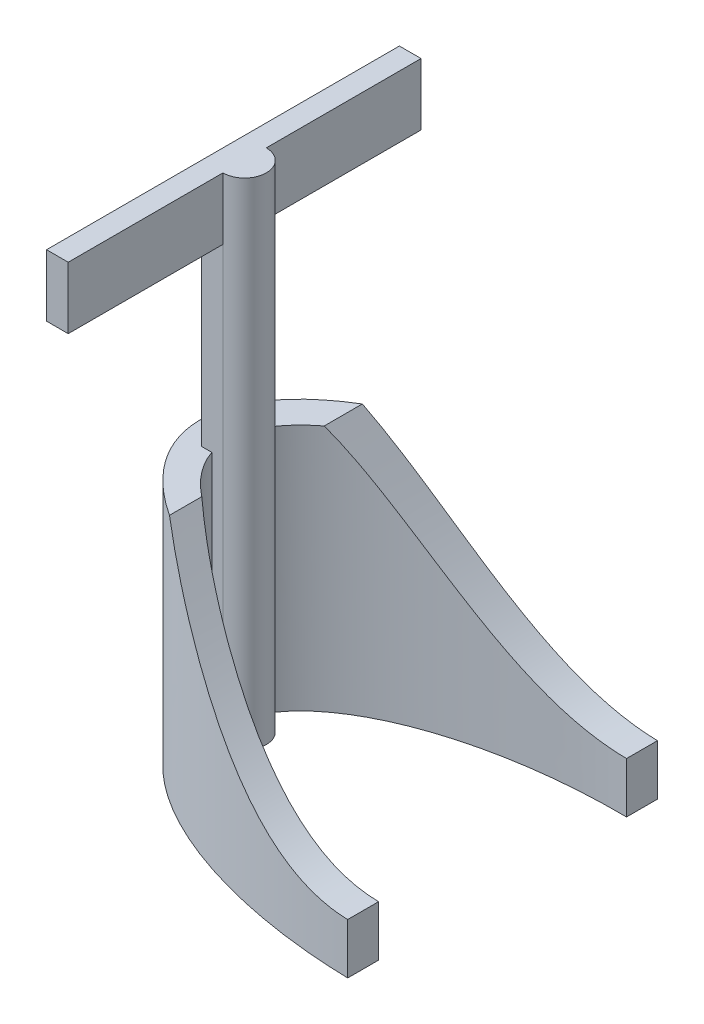
ISO-10303-21;
HEADER;
FILE_DESCRIPTION(('STEP AP214'),'2;1');
FILE_NAME('part.step','',(''),(''),'','','');
FILE_SCHEMA(('AUTOMOTIVE_DESIGN { 1 0 10303 214 1 1 1 1 }'));
ENDSEC;
DATA;
#1=APPLICATION_CONTEXT('core data for automotive mechanical design processes');
#2=APPLICATION_PROTOCOL_DEFINITION('international standard','automotive_design',2000,#1);
#3=PRODUCT_CONTEXT('',#1,'mechanical');
#4=PRODUCT('Part','Part','',(#3));
#5=PRODUCT_RELATED_PRODUCT_CATEGORY('part','',(#4));
#6=PRODUCT_DEFINITION_FORMATION('','',#4);
#7=PRODUCT_DEFINITION_CONTEXT('part definition',#1,'design');
#8=PRODUCT_DEFINITION('design','',#6,#7);
#9=PRODUCT_DEFINITION_SHAPE('','',#8);
#10=(LENGTH_UNIT() NAMED_UNIT(*) SI_UNIT(.MILLI.,.METRE.));
#11=(NAMED_UNIT(*) PLANE_ANGLE_UNIT() SI_UNIT($,.RADIAN.));
#12=(NAMED_UNIT(*) SI_UNIT($,.STERADIAN.) SOLID_ANGLE_UNIT());
#13=UNCERTAINTY_MEASURE_WITH_UNIT(LENGTH_MEASURE(1.E-05),#10,'distance_accuracy_value','');
#14=(GEOMETRIC_REPRESENTATION_CONTEXT(3) GLOBAL_UNCERTAINTY_ASSIGNED_CONTEXT((#13)) GLOBAL_UNIT_ASSIGNED_CONTEXT((#10,
#11,#12)) REPRESENTATION_CONTEXT('',''));
#15=CARTESIAN_POINT('',(0.,0.,0.));
#16=DIRECTION('',(0.,0.,1.));
#17=DIRECTION('',(1.,0.,0.));
#18=AXIS2_PLACEMENT_3D('',#15,#16,#17);
#19=CARTESIAN_POINT('',(-46.2169440098117,0.,-4.54650732705689));
#20=DIRECTION('',(0.,0.,-1.));
#21=DIRECTION('',(-1.,0.,0.));
#22=AXIS2_PLACEMENT_3D('',#19,#20,#21);
#23=PLANE('',#22);
#24=DIRECTION('',(0.,1.,0.));
#25=VECTOR('',#24,1.);
#26=CARTESIAN_POINT('',(-46.2169440098117,0.,-4.54650732705689));
#27=LINE('',#26,#25);
#28=CARTESIAN_POINT('',(-46.2169440098117,40.,-4.54650732705689));
#29=VERTEX_POINT('',#28);
#30=CARTESIAN_POINT('',(-46.2169440098117,70.,-4.54650732705689));
#31=VERTEX_POINT('',#30);
#32=EDGE_CURVE('E322',#29,#31,#27,.T.);
#33=ORIENTED_EDGE('',*,*,#32,.T.);
#34=DIRECTION('',(-1.,0.,0.));
#35=VECTOR('',#34,1.);
#36=CARTESIAN_POINT('',(-42.7169440098117,70.,-4.54650732705689));
#37=LINE('',#36,#35);
#38=CARTESIAN_POINT('',(-42.7169440098117,70.,-4.54650732705689));
#39=VERTEX_POINT('',#38);
#40=EDGE_CURVE('E181',#39,#31,#37,.T.);
#41=ORIENTED_EDGE('',*,*,#40,.F.);
#42=DIRECTION('',(0.,1.,0.));
#43=VECTOR('',#42,1.);
#44=CARTESIAN_POINT('',(-42.7169440098117,0.,-4.54650732705689));
#45=LINE('',#44,#43);
#46=CARTESIAN_POINT('',(-42.7169440098117,0.,-4.54650732705689));
#47=VERTEX_POINT('',#46);
#48=EDGE_CURVE('E302',#39,#47,#45,.F.);
#49=ORIENTED_EDGE('',*,*,#48,.T.);
#50=DIRECTION('',(-1.,0.,0.));
#51=VECTOR('',#50,1.);
#52=CARTESIAN_POINT('',(-46.2169440098117,0.,-4.54650732705689));
#53=LINE('',#52,#51);
#54=CARTESIAN_POINT('',(-44.0652315849738,0.,-4.54650732705689));
#55=VERTEX_POINT('',#54);
#56=EDGE_CURVE('E315',#47,#55,#53,.T.);
#57=ORIENTED_EDGE('',*,*,#56,.T.);
#58=DIRECTION('',(0.,1.,0.));
#59=VECTOR('',#58,1.);
#60=CARTESIAN_POINT('',(-44.0652315849738,0.,-4.54650732705689));
#61=LINE('',#60,#59);
#62=CARTESIAN_POINT('',(-44.0652315849738,40.,-4.54650732705689));
#63=VERTEX_POINT('',#62);
#64=EDGE_CURVE('E295',#63,#55,#61,.F.);
#65=ORIENTED_EDGE('',*,*,#64,.F.);
#66=DIRECTION('',(-1.,0.,0.));
#67=VECTOR('',#66,1.);
#68=CARTESIAN_POINT('',(0.,40.,-4.54650732705689));
#69=LINE('',#68,#67);
#70=EDGE_CURVE('E331',#63,#29,#69,.T.);
#71=ORIENTED_EDGE('',*,*,#70,.T.);
#72=EDGE_LOOP('',(#33,#41,#49,#57,#65,#71));
#73=FACE_BOUND('',#72,.T.);
#74=ADVANCED_FACE('F41',(#73),#23,.T.);
#75=CARTESIAN_POINT('',(-46.2169440098117,0.,2.45349267294311));
#76=DIRECTION('',(0.,0.,1.));
#77=DIRECTION('',(1.,0.,0.));
#78=AXIS2_PLACEMENT_3D('',#75,#76,#77);
#79=PLANE('',#78);
#80=DIRECTION('',(0.,1.,0.));
#81=VECTOR('',#80,1.);
#82=CARTESIAN_POINT('',(-42.7169440098117,0.,2.45349267294311));
#83=LINE('',#82,#81);
#84=CARTESIAN_POINT('',(-42.7169440098117,0.,2.45349267294311));
#85=VERTEX_POINT('',#84);
#86=CARTESIAN_POINT('',(-42.7169440098117,70.,2.45349267294311));
#87=VERTEX_POINT('',#86);
#88=EDGE_CURVE('E308',#85,#87,#83,.T.);
#89=ORIENTED_EDGE('',*,*,#88,.T.);
#90=DIRECTION('',(1.,0.,0.));
#91=VECTOR('',#90,1.);
#92=CARTESIAN_POINT('',(-46.2169440098117,70.,2.45349267294311));
#93=LINE('',#92,#91);
#94=CARTESIAN_POINT('',(-46.2169440098117,70.,2.45349267294311));
#95=VERTEX_POINT('',#94);
#96=EDGE_CURVE('E187',#95,#87,#93,.T.);
#97=ORIENTED_EDGE('',*,*,#96,.F.);
#98=DIRECTION('',(0.,1.,0.));
#99=VECTOR('',#98,1.);
#100=CARTESIAN_POINT('',(-46.2169440098117,0.,2.45349267294311));
#101=LINE('',#100,#99);
#102=CARTESIAN_POINT('',(-46.2169440098117,40.,2.45349267294311));
#103=VERTEX_POINT('',#102);
#104=EDGE_CURVE('E318',#103,#95,#101,.T.);
#105=ORIENTED_EDGE('',*,*,#104,.F.);
#106=DIRECTION('',(1.,0.,0.));
#107=VECTOR('',#106,1.);
#108=CARTESIAN_POINT('',(0.,40.,2.45349267294311));
#109=LINE('',#108,#107);
#110=CARTESIAN_POINT('',(-44.5125584969487,40.,2.4534926729431));
#111=VERTEX_POINT('',#110);
#112=EDGE_CURVE('E328',#103,#111,#109,.T.);
#113=ORIENTED_EDGE('',*,*,#112,.T.);
#114=DIRECTION('',(0.,1.,0.));
#115=VECTOR('',#114,1.);
#116=CARTESIAN_POINT('',(-44.5125584969487,0.,2.45349267294311));
#117=LINE('',#116,#115);
#118=CARTESIAN_POINT('',(-44.5125584969487,0.,2.45349267294309));
#119=VERTEX_POINT('',#118);
#120=EDGE_CURVE('E293',#119,#111,#117,.T.);
#121=ORIENTED_EDGE('',*,*,#120,.F.);
#122=DIRECTION('',(1.,0.,0.));
#123=VECTOR('',#122,1.);
#124=CARTESIAN_POINT('',(-46.2169440098117,0.,2.45349267294311));
#125=LINE('',#124,#123);
#126=EDGE_CURVE('E319',#119,#85,#125,.T.);
#127=ORIENTED_EDGE('',*,*,#126,.T.);
#128=EDGE_LOOP('',(#89,#97,#105,#113,#121,#127));
#129=FACE_BOUND('',#128,.T.);
#130=ADVANCED_FACE('F361',(#129),#79,.T.);
#131=CARTESIAN_POINT('',(-42.7169440098117,80.,-1.04650732705689));
#132=DIRECTION('',(0.,1.,0.));
#133=DIRECTION('',(0.,0.,1.));
#134=AXIS2_PLACEMENT_3D('',#131,#132,#133);
#135=CYLINDRICAL_SURFACE('',#134,3.5);
#136=CARTESIAN_POINT('',(-42.7169440098117,80.,-4.54650732705689));
#137=VERTEX_POINT('',#136);
#138=EDGE_CURVE('E185',#137,#39,#45,.F.);
#139=ORIENTED_EDGE('',*,*,#138,.F.);
#140=CARTESIAN_POINT('',(-42.7169440098117,80.,-1.04650732705689));
#141=DIRECTION('',(0.,1.,0.));
#142=DIRECTION('',(0.,0.,1.));
#143=AXIS2_PLACEMENT_3D('',#140,#141,#142);
#144=CIRCLE('',#143,3.5);
#145=CARTESIAN_POINT('',(-42.7169440098117,80.,2.45349267294311));
#146=VERTEX_POINT('',#145);
#147=EDGE_CURVE('E50',#146,#137,#144,.T.);
#148=ORIENTED_EDGE('',*,*,#147,.F.);
#149=DIRECTION('',(0.,1.,0.));
#150=VECTOR('',#149,1.);
#151=CARTESIAN_POINT('',(-42.7169440098117,80.,2.45349267294311));
#152=LINE('',#151,#150);
#153=EDGE_CURVE('E189',#87,#146,#152,.T.);
#154=ORIENTED_EDGE('',*,*,#153,.F.);
#155=ORIENTED_EDGE('',*,*,#88,.F.);
#156=CARTESIAN_POINT('',(-42.7169440098117,0.,-1.04650732705689));
#157=DIRECTION('',(0.,1.,0.));
#158=DIRECTION('',(0.,0.,1.));
#159=AXIS2_PLACEMENT_3D('',#156,#157,#158);
#160=CIRCLE('',#159,3.5);
#161=EDGE_CURVE('E11',#47,#85,#160,.F.);
#162=ORIENTED_EDGE('',*,*,#161,.F.);
#163=ORIENTED_EDGE('',*,*,#48,.F.);
#164=EDGE_LOOP('',(#139,#148,#154,#155,#162,#163));
#165=FACE_BOUND('',#164,.T.);
#166=ADVANCED_FACE('F44',(#165),#135,.T.);
#167=CARTESIAN_POINT('',(0.,0.,0.));
#168=DIRECTION('',(0.,1.,0.));
#169=DIRECTION('',(0.999906273096402,0.,0.0136910562946586));
#170=AXIS2_PLACEMENT_3D('',#167,#168,#169);
#171=ELLIPSE('',#170,45.0042181060119,20.0259893045715);
#172=DIRECTION('',(0.,1.,0.));
#173=VECTOR('',#172,1.);
#174=SURFACE_OF_LINEAR_EXTRUSION('',#171,#173);
#175=CARTESIAN_POINT('',(-39.1310904542781,40.,-10.3196836821225));
#176=CARTESIAN_POINT('',(-38.9998049745195,39.814564734595,-10.4211225183269));
#177=CARTESIAN_POINT('',(-38.8680689107961,39.6284922208081,-10.5207972536929));
#178=CARTESIAN_POINT('',(-38.6037477692581,39.2552237566391,-10.716843044213));
#179=CARTESIAN_POINT('',(-38.4711627206403,39.0680278449046,-10.813214212261));
#180=CARTESIAN_POINT('',(-38.0723423076516,38.5051650180911,-11.0976170059595));
#181=CARTESIAN_POINT('',(-37.8048999089887,38.1280226042761,-11.2810468852849));
#182=CARTESIAN_POINT('',(-37.2670766666245,37.3708522537992,-11.6370973633573));
#183=CARTESIAN_POINT('',(-36.9966962089053,36.9908246980979,-11.8097193622946));
#184=CARTESIAN_POINT('',(-36.4538177281195,36.2297229046969,-12.1449349002623));
#185=CARTESIAN_POINT('',(-36.1813279470645,35.8486547462869,-12.3075556449352));
#186=CARTESIAN_POINT('',(-35.6334180935527,35.0850338309468,-12.6243428865481));
#187=CARTESIAN_POINT('',(-35.3579976296973,34.7024808801659,-12.7785082368945));
#188=CARTESIAN_POINT('',(-34.8041445590967,33.9365213241368,-13.0792244002623));
#189=CARTESIAN_POINT('',(-34.5257117154659,33.553114653665,-13.2257746091129));
#190=CARTESIAN_POINT('',(-33.7429582578763,32.4809273332778,-13.6258286700174));
#191=CARTESIAN_POINT('',(-33.2351340952529,31.7918382864425,-13.8716787219167));
#192=CARTESIAN_POINT('',(-32.208038287672,30.4157357482259,-14.3445565858386));
#193=CARTESIAN_POINT('',(-31.6887663074604,29.7287223183015,-14.5715838456984));
#194=CARTESIAN_POINT('',(-30.637007922253,28.3595394559415,-15.0093485044357));
#195=CARTESIAN_POINT('',(-30.1045204698313,27.6773704130065,-15.2200846066341));
#196=CARTESIAN_POINT('',(-29.0217892433662,26.3176731391641,-15.628102327966));
#197=CARTESIAN_POINT('',(-28.4714743327757,25.6401813097985,-15.825316726721));
#198=CARTESIAN_POINT('',(-27.3530819333269,24.2963015295646,-16.2066212472192));
#199=CARTESIAN_POINT('',(-26.7850056291754,23.6299128426287,-16.3907122416344));
#200=CARTESIAN_POINT('',(-25.6283401438172,22.311801538597,-16.7467771738113));
#201=CARTESIAN_POINT('',(-25.0397508122072,21.6600790290926,-16.9187510227009));
#202=CARTESIAN_POINT('',(-23.8306687003862,20.36652528896,-17.253507547877));
#203=CARTESIAN_POINT('',(-23.2098444422577,19.724960626518,-17.416127665355));
#204=CARTESIAN_POINT('',(-21.9406644082228,18.4664737298719,-17.7297533305684));
#205=CARTESIAN_POINT('',(-21.2923064504892,17.8495534560854,-17.8807579551927));
#206=CARTESIAN_POINT('',(-19.9642809397788,16.6464283711782,-18.1710224974976));
#207=CARTESIAN_POINT('',(-19.2845946186483,16.0602424338284,-18.3102752296766));
#208=CARTESIAN_POINT('',(-17.8954426632097,14.9303653305458,-18.5754242332665));
#209=CARTESIAN_POINT('',(-17.1861949025521,14.3864267122021,-18.7014001155562));
#210=CARTESIAN_POINT('',(-15.7316616817968,13.3463137855611,-18.9398117797111));
#211=CARTESIAN_POINT('',(-14.9863940654503,12.8501161840801,-19.052254171453));
#212=CARTESIAN_POINT('',(-13.4587925382474,11.9162278622056,-19.2619439286983));
#213=CARTESIAN_POINT('',(-12.6765036794119,11.4784683869674,-19.3592091739116));
#214=CARTESIAN_POINT('',(-11.4469657646645,10.8595959749856,-19.4954254909251));
#215=CARTESIAN_POINT('',(-11.0127706091471,10.6536808607463,-19.5404862697482));
#216=CARTESIAN_POINT('',(-10.134211569928,10.2635254737578,-19.6253546130421));
#217=CARTESIAN_POINT('',(-9.68984805740612,10.0792844113345,-19.6651623689084));
#218=CARTESIAN_POINT('',(-8.7916290984772,9.73416709883579,-19.7391737975997));
#219=CARTESIAN_POINT('',(-8.33777297167822,9.57329253018636,-19.7733770671548));
#220=CARTESIAN_POINT('',(-7.42213808608347,9.27663137391774,-19.8357956162461));
#221=CARTESIAN_POINT('',(-6.96036999623517,9.14081352373134,-19.8640183641392));
#222=CARTESIAN_POINT('',(-6.02963125470742,8.89529284471256,-19.9142157724557));
#223=CARTESIAN_POINT('',(-5.56066100306232,8.78558857098139,-19.936190778588));
#224=CARTESIAN_POINT('',(-4.6171398632267,8.59326010083494,-19.9736204016194));
#225=CARTESIAN_POINT('',(-4.14259187322644,8.5106224335883,-19.9890782631524));
#226=CARTESIAN_POINT('',(-3.4637729992627,8.41252879238316,-20.006318646883));
#227=CARTESIAN_POINT('',(-3.26114599499253,8.38578118646915,-20.0108514115562));
#228=CARTESIAN_POINT('',(-2.85530856842053,8.33725975912449,-20.0186977932172));
#229=CARTESIAN_POINT('',(-2.65209827368623,8.31548492327792,-20.0220116589376));
#230=CARTESIAN_POINT('',(-2.2452135670234,8.27690868115327,-20.0274118394743));
#231=CARTESIAN_POINT('',(-2.04153920155565,8.26010679730315,-20.0294982721847));
#232=CARTESIAN_POINT('',(-1.5319144273683,8.22430480585537,-20.0331715982793));
#233=CARTESIAN_POINT('',(-1.22573565859301,8.20840477115582,-20.0339873415844));
#234=CARTESIAN_POINT('',(-0.612934821383895,8.18765602243178,-20.0328326119535));
#235=CARTESIAN_POINT('',(-0.30631266417538,8.18280996233718,-20.030861470103));
#236=CARTESIAN_POINT('',(0.00026808519977019,8.18343967274385,-20.0274917787802));
#237=B_SPLINE_CURVE_WITH_KNOTS('',3,(#175,#176,#177,#178,#179,#180,#181,#182,#183,#184,#185,
#186,#187,#188,#189,#190,#191,#192,#193,#194,#195,#196,#197,#198,#199,#200,#201,#202,#203,#204,
#205,#206,#207,#208,#209,#210,#211,#212,#213,#214,#215,#216,#217,#218,#219,#220,#221,#222,#223,
#224,#225,#226,#227,#228,#229,#230,#231,#232,#233,#234,#235,#236),.UNSPECIFIED.,.F.,.F.,(4,2,2,
2,2,2,2,2,2,2,2,2,2,2,2,2,2,2,2,2,2,2,2,2,2,2,2,2,2,2,4),(0.,0.746445166798173,1.49286479959908,
2.98489861202233,4.47673872571109,5.96432269842842,7.45210789871622,8.94001095739162,
11.6114876508187,14.2830426837579,16.954810138087,19.6390187102711,22.3230486228099,
25.0070982190432,27.7287581388398,30.4506341324815,33.1741624935523,35.8802994880004,
38.5851093711468,41.2867083475384,42.734152642142,44.1815441841134,45.6290398271761,
47.0747170727485,48.5203143084801,49.9651909850311,50.5784471963468,51.1915781950225,
51.8046502932091,52.7242044398128,53.6439793373754),.UNSPECIFIED.);
#238=CARTESIAN_POINT('',(-39.1310904542781,40.,-10.3196836821224));
#239=VERTEX_POINT('',#238);
#240=CARTESIAN_POINT('',(0.000268085199773768,8.18343967274385,-20.0274917787802));
#241=VERTEX_POINT('',#240);
#242=EDGE_CURVE('E260',#239,#241,#237,.T.);
#243=ORIENTED_EDGE('',*,*,#242,.F.);
#244=CARTESIAN_POINT('',(0.,40.,0.));
#245=DIRECTION('',(0.,1.,0.));
#246=DIRECTION('',(0.999906273096402,0.,0.0136910562946586));
#247=AXIS2_PLACEMENT_3D('',#244,#245,#246);
#248=ELLIPSE('',#247,45.0042181060119,20.0259893045715);
#249=EDGE_CURVE('E340',#239,#63,#248,.T.);
#250=ORIENTED_EDGE('',*,*,#249,.T.);
#251=ORIENTED_EDGE('',*,*,#64,.T.);
#252=CARTESIAN_POINT('',(0.000268085199773838,0.,-20.0274917787802));
#253=VERTEX_POINT('',#252);
#254=EDGE_CURVE('E317',#253,#55,#171,.T.);
#255=ORIENTED_EDGE('',*,*,#254,.F.);
#256=DIRECTION('',(0.,1.,0.));
#257=VECTOR('',#256,1.);
#258=CARTESIAN_POINT('',(0.000268085199773768,0.,-20.0274917787802));
#259=LINE('',#258,#257);
#260=EDGE_CURVE('E283',#241,#253,#259,.F.);
#261=ORIENTED_EDGE('',*,*,#260,.F.);
#262=EDGE_LOOP('',(#243,#250,#251,#255,#261));
#263=FACE_BOUND('',#262,.T.);
#264=ADVANCED_FACE('F342',(#263),#174,.F.);
#265=CARTESIAN_POINT('',(0.000268085199773226,0.,-25.0204545710766));
#266=DIRECTION('',(-1.,0.,0.));
#267=DIRECTION('',(0.,0.,1.));
#268=AXIS2_PLACEMENT_3D('',#265,#266,#267);
#269=PLANE('',#268);
#270=DIRECTION('',(0.,0.,-1.));
#271=VECTOR('',#270,1.);
#272=CARTESIAN_POINT('',(0.000268085199792314,8.18343967274385,144.709903717956));
#273=LINE('',#272,#271);
#274=CARTESIAN_POINT('',(0.000268085199779406,8.18343967274385,25.0204668673225));
#275=VERTEX_POINT('',#274);
#276=CARTESIAN_POINT('',(0.00026808519977881,8.18343967274385,20.0274976663316));
#277=VERTEX_POINT('',#276);
#278=EDGE_CURVE('E390',#275,#277,#273,.T.);
#279=ORIENTED_EDGE('',*,*,#278,.F.);
#280=DIRECTION('',(0.,-1.,0.));
#281=VECTOR('',#280,1.);
#282=CARTESIAN_POINT('',(0.000268085199779406,40.,25.0204668673225));
#283=LINE('',#282,#281);
#284=CARTESIAN_POINT('',(0.000268085199779354,0.,25.0204668673225));
#285=VERTEX_POINT('',#284);
#286=EDGE_CURVE('E285',#285,#275,#283,.F.);
#287=ORIENTED_EDGE('',*,*,#286,.F.);
#288=DIRECTION('',(0.,0.,1.));
#289=VECTOR('',#288,1.);
#290=CARTESIAN_POINT('',(0.000268085199773226,0.,-25.0204545710766));
#291=LINE('',#290,#289);
#292=CARTESIAN_POINT('',(0.000268085199778743,0.,20.0274976663316));
#293=VERTEX_POINT('',#292);
#294=EDGE_CURVE('E338',#293,#285,#291,.T.);
#295=ORIENTED_EDGE('',*,*,#294,.F.);
#296=DIRECTION('',(0.,1.,0.));
#297=VECTOR('',#296,1.);
#298=CARTESIAN_POINT('',(0.00026808519977881,0.,20.0274976663316));
#299=LINE('',#298,#297);
#300=EDGE_CURVE('E290',#293,#277,#299,.T.);
#301=ORIENTED_EDGE('',*,*,#300,.T.);
#302=EDGE_LOOP('',(#279,#287,#295,#301));
#303=FACE_BOUND('',#302,.T.);
#304=ADVANCED_FACE('F273',(#303),#269,.F.);
#305=CARTESIAN_POINT('',(0.,40.,0.));
#306=DIRECTION('',(0.,1.,0.));
#307=DIRECTION('',(0.999532603527299,0.,0.0305708110121383));
#308=AXIS2_PLACEMENT_3D('',#305,#306,#307);
#309=ELLIPSE('',#308,50.023380751716,25.011690375858);
#310=DIRECTION('',(0.,-1.,0.));
#311=VECTOR('',#310,1.);
#312=SURFACE_OF_LINEAR_EXTRUSION('',#309,#311);
#313=CARTESIAN_POINT('',(-39.1310904542781,40.,14.6806397488417));
#314=CARTESIAN_POINT('',(-38.9424088943499,39.7334953671058,14.8036180453569));
#315=CARTESIAN_POINT('',(-38.7533105400779,39.4664004144856,14.9246630214393));
#316=CARTESIAN_POINT('',(-38.3742479913657,38.9312107743613,15.1631157039195));
#317=CARTESIAN_POINT('',(-38.1842838125995,38.6631161049707,15.2805234758637));
#318=CARTESIAN_POINT('',(-37.6131231259071,37.8577151835847,15.6275873754231));
#319=CARTESIAN_POINT('',(-37.2305701252793,37.3191670265593,15.8521414706754));
#320=CARTESIAN_POINT('',(-36.4614582802074,36.2401030309426,16.2891889860367));
#321=CARTESIAN_POINT('',(-36.0748996273405,35.6995872872492,16.5016829798205));
#322=CARTESIAN_POINT('',(-35.2988678864496,34.6200849639547,16.9150412940178));
#323=CARTESIAN_POINT('',(-34.9094145717738,34.081101850064,17.1159518402145));
#324=CARTESIAN_POINT('',(-34.1252636628612,33.0034352270473,17.5082340489551));
#325=CARTESIAN_POINT('',(-33.7305657887879,32.4647517355191,17.6996051998914));
#326=CARTESIAN_POINT('',(-32.9351586313314,31.3888023814698,18.0737289790571));
#327=CARTESIAN_POINT('',(-32.5344491478,30.8515365668516,18.2564813194923));
#328=CARTESIAN_POINT('',(-31.7263461050188,29.7798079027465,18.6140603108301));
#329=CARTESIAN_POINT('',(-31.3189556696324,29.2453438892522,18.7888905297042));
#330=CARTESIAN_POINT('',(-30.4963662349771,28.1801601451261,19.1313616165048));
#331=CARTESIAN_POINT('',(-30.081167500091,27.6494402885539,19.2990027272205));
#332=CARTESIAN_POINT('',(-29.2419006100914,26.5929829560479,19.6276400422237));
#333=CARTESIAN_POINT('',(-28.8178325699373,26.067245415664,19.7886363325575));
#334=CARTESIAN_POINT('',(-27.9574532493613,25.0194036197387,20.105239684867));
#335=CARTESIAN_POINT('',(-27.5210899181306,24.4973323025041,20.2608145021026));
#336=CARTESIAN_POINT('',(-26.6369673352263,23.4611226912835,20.5660374559357));
#337=CARTESIAN_POINT('',(-26.1892077973455,22.9469845970562,20.7156854434434));
#338=CARTESIAN_POINT('',(-25.2809005438618,21.9283487495645,21.009303660937));
#339=CARTESIAN_POINT('',(-24.8203512430862,21.4238522044802,21.1532731817292));
#340=CARTESIAN_POINT('',(-23.7053700236321,20.2349142445701,21.4899141085105));
#341=CARTESIAN_POINT('',(-23.044433869379,19.5558116915252,21.6800439610579));
#342=CARTESIAN_POINT('',(-21.6912759597188,18.2261752586638,22.0496897261115));
#343=CARTESIAN_POINT('',(-20.9990502930721,17.5756449705775,22.2292043051816));
#344=CARTESIAN_POINT('',(-19.578667824542,16.3104886118684,22.5772645948623));
#345=CARTESIAN_POINT('',(-18.8504835292471,15.6958908239795,22.7458016765959));
#346=CARTESIAN_POINT('',(-17.360302614809,14.5170506589573,23.0695368519891));
#347=CARTESIAN_POINT('',(-16.598591901881,13.952473186669,23.2248234053152));
#348=CARTESIAN_POINT('',(-15.0338141463943,12.8802092910798,23.5217328011842));
#349=CARTESIAN_POINT('',(-14.2307743510963,12.3724860690166,23.6633644734615));
#350=CARTESIAN_POINT('',(-12.9949756426517,11.6635487804138,23.8637795151676));
#351=CARTESIAN_POINT('',(-12.5780997479925,11.4361335123557,23.9285433121946));
#352=CARTESIAN_POINT('',(-11.7338808328716,11.0003983104193,24.0537622105901));
#353=CARTESIAN_POINT('',(-11.306539361834,10.7920755713,24.1142179446456));
#354=CARTESIAN_POINT('',(-10.4419201908208,10.39633540086,24.2304275760337));
#355=CARTESIAN_POINT('',(-10.004647895865,10.2089069108609,24.2861839567397));
#356=CARTESIAN_POINT('',(-9.12053093643937,9.85649548572459,24.3926439433611));
#357=CARTESIAN_POINT('',(-8.67368643090641,9.69151217824159,24.4433476330926));
#358=CARTESIAN_POINT('',(-7.7712287752477,9.38551458883546,24.5393162449513));
#359=CARTESIAN_POINT('',(-7.3156148821296,9.24450234791748,24.5845807038617));
#360=CARTESIAN_POINT('',(-6.39733410452821,8.98794825167144,24.6692362464039));
#361=CARTESIAN_POINT('',(-5.93467673774275,8.8723748107001,24.708634593689));
#362=CARTESIAN_POINT('',(-5.00313865684146,8.6675057642073,24.7812802605848));
#363=CARTESIAN_POINT('',(-4.53425841778301,8.57820816469688,24.8145280468708));
#364=CARTESIAN_POINT('',(-3.59198756904144,8.4265797264083,24.8745706891484));
#365=CARTESIAN_POINT('',(-3.11859970673089,8.36423341719375,24.9013692431671));
#366=CARTESIAN_POINT('',(-2.42416510423468,8.29290986835366,24.9356912556502));
#367=CARTESIAN_POINT('',(-2.20429278556848,8.27326128498553,24.9458312077771));
#368=CARTESIAN_POINT('',(-1.76408598312972,8.23975429942922,24.9646729478871));
#369=CARTESIAN_POINT('',(-1.54375160779458,8.22589466460687,24.973375041793));
#370=CARTESIAN_POINT('',(-1.10291580553308,8.20394713987316,24.9893237144114));
#371=CARTESIAN_POINT('',(-0.882414638210588,8.1958548100997,24.9965714096732));
#372=CARTESIAN_POINT('',(-0.441189820752671,8.18537689239559,25.0096126174175));
#373=CARTESIAN_POINT('',(-0.220466135194092,8.18299243539679,25.0154058415142));
#374=CARTESIAN_POINT('',(0.000268085199767805,8.18343967274386,25.0204668673225));
#375=B_SPLINE_CURVE_WITH_KNOTS('',3,(#313,#314,#315,#316,#317,#318,#319,#320,#321,#322,#323,
#324,#325,#326,#327,#328,#329,#330,#331,#332,#333,#334,#335,#336,#337,#338,#339,#340,#341,#342,
#343,#344,#345,#346,#347,#348,#349,#350,#351,#352,#353,#354,#355,#356,#357,#358,#359,#360,#361,
#362,#363,#364,#365,#366,#367,#368,#369,#370,#371,#372,#373,#374),.UNSPECIFIED.,.F.,.F.,(4,2,2,
2,2,2,2,2,2,2,2,2,2,2,2,2,2,2,2,2,2,2,2,2,2,2,2,2,2,2,4),(0.,1.04676230723217,2.09350573968514,
4.18650231681829,6.27939925070759,8.36326528818905,10.447242965616,12.5312901808099,
14.6143892573811,16.6974179283985,18.7804196169723,20.8742137985684,22.9680606162178,
25.0621681152896,27.9608834055108,30.8599620473241,33.7612926773948,36.6414258842888,
39.5196840240607,40.9570624728621,42.394229389749,43.830632010719,45.2670108001299,
46.7035118281444,48.1382190603598,49.5728173891703,51.0065911404572,51.6694709131496,
52.3322094675686,52.9944372712087,53.6567962747842),.UNSPECIFIED.);
#376=CARTESIAN_POINT('',(-39.1310904542781,40.,14.6806397488418));
#377=VERTEX_POINT('',#376);
#378=EDGE_CURVE('E247',#377,#275,#375,.T.);
#379=ORIENTED_EDGE('',*,*,#378,.F.);
#380=CARTESIAN_POINT('',(-39.1310904542781,40.,-16.4754628542309));
#381=VERTEX_POINT('',#380);
#382=EDGE_CURVE('E278',#381,#377,#309,.T.);
#383=ORIENTED_EDGE('',*,*,#382,.F.);
#384=CARTESIAN_POINT('',(0.00026808519977404,8.18343967274385,-25.0204545710766));
#385=CARTESIAN_POINT('',(-0.237663547524911,8.18295859941995,-25.0259122067507));
#386=CARTESIAN_POINT('',(-0.475609466837963,8.18576574010349,-25.0305195754243));
#387=CARTESIAN_POINT('',(-0.951360017392876,8.19802474149152,-25.0380333814466));
#388=CARTESIAN_POINT('',(-1.1891646465668,8.20747669716369,-25.0409397944841));
#389=CARTESIAN_POINT('',(-1.901780028337,8.24588477718916,-25.0471040249911));
#390=CARTESIAN_POINT('',(-2.37611470052742,8.2848922850199,-25.0478142185399));
#391=CARTESIAN_POINT('',(-3.32160650321713,8.38987130073738,-25.0425022197364));
#392=CARTESIAN_POINT('',(-3.79276439935742,8.45583605691276,-25.0364817125002));
#393=CARTESIAN_POINT('',(-4.72471977603803,8.61350209504403,-25.0179701477233));
#394=CARTESIAN_POINT('',(-5.18557354542412,8.70488003179574,-25.0055588160084));
#395=CARTESIAN_POINT('',(-6.10132674142396,8.91306695219205,-24.9745177479697));
#396=CARTESIAN_POINT('',(-6.55622558834293,9.02987839248427,-24.9558874108532));
#397=CARTESIAN_POINT('',(-7.45874901350419,9.28794566748326,-24.9126741001274));
#398=CARTESIAN_POINT('',(-7.90637320221027,9.42920280649726,-24.8880908088687));
#399=CARTESIAN_POINT('',(-8.89338739311188,9.76941999525286,-24.8270895209923));
#400=CARTESIAN_POINT('',(-9.43068632911042,9.97420786127367,-24.7892527135032));
#401=CARTESIAN_POINT('',(-10.4913766586585,10.4159522220331,-24.7057004605933));
#402=CARTESIAN_POINT('',(-11.0147639592943,10.6529180612219,-24.6599827255162));
#403=CARTESIAN_POINT('',(-12.0466180372222,11.156009858738,-24.5613006885243));
#404=CARTESIAN_POINT('',(-12.5550839245282,11.4221375519575,-24.5083359554256));
#405=CARTESIAN_POINT('',(-13.5587822981327,11.9816881847828,-24.3955253026919));
#406=CARTESIAN_POINT('',(-14.05394951502,12.2752220987166,-24.3356511521148));
#407=CARTESIAN_POINT('',(-15.0287620746305,12.8856014709885,-24.2097670618705));
#408=CARTESIAN_POINT('',(-15.5084092961012,13.2024440924136,-24.1437578686452));
#409=CARTESIAN_POINT('',(-16.4525968744846,13.8566742906912,-24.0060824667447));
#410=CARTESIAN_POINT('',(-16.9171371475266,14.1940619815758,-23.9344162266702));
#411=CARTESIAN_POINT('',(-17.8892346983355,14.9304026531263,-23.7764871628737));
#412=CARTESIAN_POINT('',(-18.3948524804619,15.3317613644261,-23.6895222245755));
#413=CARTESIAN_POINT('',(-19.3887740740697,16.1540182376621,-23.5093988351776));
#414=CARTESIAN_POINT('',(-19.8770771125949,16.5749172699756,-23.4162401081103));
#415=CARTESIAN_POINT('',(-20.8375868035239,17.433405528944,-23.2240663750982));
#416=CARTESIAN_POINT('',(-21.3097928022637,17.8709954318517,-23.1250511317792));
#417=CARTESIAN_POINT('',(-22.2389958255957,18.7600198475414,-22.9214727752237));
#418=CARTESIAN_POINT('',(-22.6960043735268,19.2114433478557,-22.8169140289352));
#419=CARTESIAN_POINT('',(-23.5964320906032,20.1262739134261,-22.6023082071939));
#420=CARTESIAN_POINT('',(-24.0398523725214,20.5896799916412,-22.4922615831048));
#421=CARTESIAN_POINT('',(-24.9143712671088,21.5266411699638,-22.2666981908403));
#422=CARTESIAN_POINT('',(-25.3454699584448,22.0001962052418,-22.151181457601));
#423=CARTESIAN_POINT('',(-26.3885553710198,23.1714275672262,-21.8612456296862));
#424=CARTESIAN_POINT('',(-26.9943962110712,23.8738215099425,-21.6837666058165));
#425=CARTESIAN_POINT('',(-28.1860017181395,25.2922486436223,-21.3166664876885));
#426=CARTESIAN_POINT('',(-28.7717665636214,26.0082817132532,-21.1270455014088));
#427=CARTESIAN_POINT('',(-29.9261355593784,27.4502069939215,-20.7348275760469));
#428=CARTESIAN_POINT('',(-30.4947441343362,28.1760965916611,-20.5322340254698));
#429=CARTESIAN_POINT('',(-31.6177007069949,29.63475670982,-20.1127673804269));
#430=CARTESIAN_POINT('',(-32.1720484755979,30.3675273405243,-19.8958940567574));
#431=CARTESIAN_POINT('',(-33.0892831339801,31.5964200385494,-19.5198125040675));
#432=CARTESIAN_POINT('',(-33.45542316302,32.0914601532519,-19.3649765518136));
#433=CARTESIAN_POINT('',(-34.1829765882573,33.0824780731933,-19.0474392843739));
#434=CARTESIAN_POINT('',(-34.5443900810163,33.5784558590383,-18.8847381301915));
#435=CARTESIAN_POINT('',(-35.2630653060886,34.5704858029571,-18.55072477643));
#436=CARTESIAN_POINT('',(-35.6203272253908,35.066537956654,-18.3794129665445));
#437=CARTESIAN_POINT('',(-36.3311844853645,36.057814277693,-18.0273031697114));
#438=CARTESIAN_POINT('',(-36.6847802351187,36.5530385321279,-17.8465062550868));
#439=CARTESIAN_POINT('',(-37.3887897297276,37.5418264754525,-17.4743541794535));
#440=CARTESIAN_POINT('',(-37.7392033454385,38.0353900964397,-17.2829985921421));
#441=CARTESIAN_POINT('',(-38.2626949360302,38.773767471831,-16.9871054616444));
#442=CARTESIAN_POINT('',(-38.4368547060094,39.01958983584,-16.8869872964936));
#443=CARTESIAN_POINT('',(-38.784483864327,39.5104315607155,-16.6836192022733));
#444=CARTESIAN_POINT('',(-38.957953242433,39.7554509096711,-16.580369226981));
#445=CARTESIAN_POINT('',(-39.1310904542781,40.,-16.4754628542311));
#446=B_SPLINE_CURVE_WITH_KNOTS('',3,(#384,#385,#386,#387,#388,#389,#390,#391,#392,#393,#394,
#395,#396,#397,#398,#399,#400,#401,#402,#403,#404,#405,#406,#407,#408,#409,#410,#411,#412,#413,
#414,#415,#416,#417,#418,#419,#420,#421,#422,#423,#424,#425,#426,#427,#428,#429,#430,#431,#432,
#433,#434,#435,#436,#437,#438,#439,#440,#441,#442,#443,#444,#445),.UNSPECIFIED.,.F.,.F.,(4,2,2,
2,2,2,2,2,2,2,2,2,2,2,2,2,2,2,2,2,2,2,2,2,2,2,2,2,2,2,4),(0.,0.713935019583914,1.42788024293129,
2.85480462983586,4.28137184813671,5.69055887145499,7.09988206999248,8.50928048656739,
10.236785426248,11.9647931087157,13.6929036493946,15.4283432298851,17.16357193761,
18.8988102773188,20.8523272147296,22.8059312505802,24.759614523562,26.7117809925372,
28.6637871647705,30.6157808716893,33.4485035218203,36.2812009840244,39.1131615248249,
41.9451675323219,43.8498064982906,45.754406492107,47.6589203666644,49.5632193915625,
51.467595358205,52.4199745971722,53.3723678992543),.UNSPECIFIED.);
#447=CARTESIAN_POINT('',(0.000268085199792314,8.18343967274385,-25.0204545710766));
#448=VERTEX_POINT('',#447);
#449=EDGE_CURVE('E254',#448,#381,#446,.T.);
#450=ORIENTED_EDGE('',*,*,#449,.F.);
#451=DIRECTION('',(0.,1.,0.));
#452=VECTOR('',#451,1.);
#453=CARTESIAN_POINT('',(0.000268085199773226,0.,-25.0204545710766));
#454=LINE('',#453,#452);
#455=CARTESIAN_POINT('',(0.000268085199773226,0.,-25.0204545710766));
#456=VERTEX_POINT('',#455);
#457=EDGE_CURVE('E393',#456,#448,#454,.T.);
#458=ORIENTED_EDGE('',*,*,#457,.F.);
#459=CARTESIAN_POINT('',(0.,0.,0.));
#460=DIRECTION('',(0.,1.,0.));
#461=DIRECTION('',(0.999532603527299,0.,0.0305708110121383));
#462=AXIS2_PLACEMENT_3D('',#459,#460,#461);
#463=ELLIPSE('',#462,50.023380751716,25.011690375858);
#464=EDGE_CURVE('E284',#456,#285,#463,.T.);
#465=ORIENTED_EDGE('',*,*,#464,.T.);
#466=ORIENTED_EDGE('',*,*,#286,.T.);
#467=EDGE_LOOP('',(#379,#383,#450,#458,#465,#466));
#468=FACE_BOUND('',#467,.T.);
#469=ADVANCED_FACE('F267',(#468),#312,.F.);
#470=CARTESIAN_POINT('',(0.,40.,0.));
#471=DIRECTION('',(0.,1.,0.));
#472=DIRECTION('',(0.,0.,1.));
#473=AXIS2_PLACEMENT_3D('',#470,#471,#472);
#474=PLANE('',#473);
#475=ORIENTED_EDGE('',*,*,#382,.T.);
#476=DIRECTION('',(0.,0.,-1.));
#477=VECTOR('',#476,1.);
#478=CARTESIAN_POINT('',(-39.1310904542781,40.,144.709903717956));
#479=LINE('',#478,#477);
#480=CARTESIAN_POINT('',(-39.1310904542781,40.,9.46030648753871));
#481=VERTEX_POINT('',#480);
#482=EDGE_CURVE('E389',#377,#481,#479,.T.);
#483=ORIENTED_EDGE('',*,*,#482,.T.);
#484=EDGE_CURVE('E335',#111,#481,#248,.T.);
#485=ORIENTED_EDGE('',*,*,#484,.F.);
#486=ORIENTED_EDGE('',*,*,#112,.F.);
#487=DIRECTION('',(0.,0.,1.));
#488=VECTOR('',#487,1.);
#489=CARTESIAN_POINT('',(-46.2169440098117,40.,0.));
#490=LINE('',#489,#488);
#491=EDGE_CURVE('E333',#29,#103,#490,.T.);
#492=ORIENTED_EDGE('',*,*,#491,.F.);
#493=ORIENTED_EDGE('',*,*,#70,.F.);
#494=ORIENTED_EDGE('',*,*,#249,.F.);
#495=EDGE_CURVE('E212',#239,#381,#479,.T.);
#496=ORIENTED_EDGE('',*,*,#495,.T.);
#497=EDGE_LOOP('',(#475,#483,#485,#486,#492,#493,#494,#496));
#498=FACE_BOUND('',#497,.T.);
#499=ADVANCED_FACE('F272',(#498),#474,.T.);
#500=DIRECTION('',(0.,0.,-1.));
#501=VECTOR('',#500,1.);
#502=CARTESIAN_POINT('',(0.000268085199792314,8.18343967274385,144.709903717956));
#503=LINE('',#502,#501);
#504=EDGE_CURVE('E261',#241,#448,#503,.T.);
#505=ORIENTED_EDGE('',*,*,#504,.F.);
#506=ORIENTED_EDGE('',*,*,#260,.T.);
#507=EDGE_CURVE('E395',#456,#253,#291,.T.);
#508=ORIENTED_EDGE('',*,*,#507,.F.);
#509=ORIENTED_EDGE('',*,*,#457,.T.);
#510=EDGE_LOOP('',(#505,#506,#508,#509));
#511=FACE_BOUND('',#510,.T.);
#512=ADVANCED_FACE('F353',(#511),#269,.F.);
#513=CARTESIAN_POINT('',(0.000268085199768347,8.18343967274385,20.0274976663316));
#514=CARTESIAN_POINT('',(-0.276638295687058,8.18287487861635,20.0244591421736));
#515=CARTESIAN_POINT('',(-0.553543100207972,8.18677186760478,20.0202804204014));
#516=CARTESIAN_POINT('',(-1.10703971579185,8.2035729589484,20.0096561693735));
#517=CARTESIAN_POINT('',(-1.3836315217954,8.21647720487413,20.0032106039863));
#518=CARTESIAN_POINT('',(-1.93587306248728,8.25135677635911,19.9880748583141));
#519=CARTESIAN_POINT('',(-2.21152350645642,8.27332189448984,19.9793872079357));
#520=CARTESIAN_POINT('',(-2.7618555247915,8.32634189964643,19.9597895403534));
#521=CARTESIAN_POINT('',(-3.03653710585543,8.35739672370767,19.9488795385439));
#522=CARTESIAN_POINT('',(-3.85841676950349,8.46415577080155,19.912870837615));
#523=CARTESIAN_POINT('',(-4.40377201125721,8.55347487314714,19.8844845649859));
#524=CARTESIAN_POINT('',(-5.47848617574184,8.76604717227195,19.819802358835));
#525=CARTESIAN_POINT('',(-6.00796204384846,8.88875391689985,19.783635608922));
#526=CARTESIAN_POINT('',(-7.05760098139249,9.16734646462247,19.7035694123433));
#527=CARTESIAN_POINT('',(-7.57776248566336,9.32323778830497,19.6596686792617));
#528=CARTESIAN_POINT('',(-8.60693966381081,9.66630379100589,19.5646365854624));
#529=CARTESIAN_POINT('',(-9.11595557806967,9.85347779458264,19.5135053808655));
#530=CARTESIAN_POINT('',(-10.1191219157145,10.2558657966873,19.4048041474708));
#531=CARTESIAN_POINT('',(-10.6133328136985,10.4709383428887,19.3472667948948));
#532=CARTESIAN_POINT('',(-11.5886526102683,10.9273893369371,19.2260662681485));
#533=CARTESIAN_POINT('',(-12.0697612528789,11.1687682982653,19.1624029744074));
#534=CARTESIAN_POINT('',(-13.0184453076622,11.6753155408062,19.0294365540019));
#535=CARTESIAN_POINT('',(-13.4860206940635,11.9404838673173,18.9601334165984));
#536=CARTESIAN_POINT('',(-14.4092979695757,12.4931772708561,18.8160522942517));
#537=CARTESIAN_POINT('',(-14.8649484207694,12.7807829026613,18.741254644732));
#538=CARTESIAN_POINT('',(-15.7627052675588,13.3750720797381,18.5868014242269));
#539=CARTESIAN_POINT('',(-16.2048125285468,13.6817544022225,18.5071461646132));
#540=CARTESIAN_POINT('',(-17.0759228679568,14.3120039093598,18.343286522582));
#541=CARTESIAN_POINT('',(-17.5049259111873,14.6355711393508,18.2590821279495));
#542=CARTESIAN_POINT('',(-18.3644610947159,15.3085961729968,18.0834940985542));
#543=CARTESIAN_POINT('',(-18.7945684753534,15.6585573260934,17.9919647707487));
#544=CARTESIAN_POINT('',(-19.6420927228396,16.3723405648174,17.8045111378048));
#545=CARTESIAN_POINT('',(-20.0595098353154,16.7361623818564,17.7085869178222));
#546=CARTESIAN_POINT('',(-20.8824451137582,17.4758899298137,17.5124669666993));
#547=CARTESIAN_POINT('',(-21.2879632004479,17.8517957412068,17.4122712071107));
#548=CARTESIAN_POINT('',(-22.0875069454525,18.6137262853665,17.2077686226527));
#549=CARTESIAN_POINT('',(-22.4815435265377,18.9997406901694,17.1034659428527));
#550=CARTESIAN_POINT('',(-23.2593274613926,19.7808256498652,16.8906565263377));
#551=CARTESIAN_POINT('',(-23.6430751612472,20.175895899317,16.78214993133));
#552=CARTESIAN_POINT('',(-24.4010803044033,20.9738593523762,16.5608644427067));
#553=CARTESIAN_POINT('',(-24.7753376741134,21.3767526166032,16.4480855159789));
#554=CARTESIAN_POINT('',(-25.5139167006749,22.1879312365543,16.2185051914717));
#555=CARTESIAN_POINT('',(-25.8782665472843,22.596194970356,16.1017179641459));
#556=CARTESIAN_POINT('',(-26.5989826691444,23.4183810846014,15.863601975808));
#557=CARTESIAN_POINT('',(-26.9553491158546,23.8323033432091,15.7422733124821));
#558=CARTESIAN_POINT('',(-27.660764562723,24.6649018189399,15.4948384006458));
#559=CARTESIAN_POINT('',(-28.0098137557466,25.0835779103137,15.3687322783045));
#560=CARTESIAN_POINT('',(-28.7012221279742,25.9248593765538,15.1114431042955));
#561=CARTESIAN_POINT('',(-29.0435814139501,26.34746468855,14.9802601337548));
#562=CARTESIAN_POINT('',(-29.7221990429236,27.1958468725247,14.7124482535777));
#563=CARTESIAN_POINT('',(-30.0584572757061,27.6216238016026,14.5758192457011));
#564=CARTESIAN_POINT('',(-30.7254306893552,28.475655036095,14.2966643922692));
#565=CARTESIAN_POINT('',(-31.0561452803438,28.903909598705,14.154137924714));
#566=CARTESIAN_POINT('',(-31.7254015083634,29.779048343828,13.856939341208));
#567=CARTESIAN_POINT('',(-32.0637382944552,30.2260018537482,13.7020099467101));
#568=CARTESIAN_POINT('',(-32.7353814250134,31.1209922304273,13.3845328756087));
#569=CARTESIAN_POINT('',(-33.0686877103533,31.5690291098481,13.2219851095539));
#570=CARTESIAN_POINT('',(-33.730635584232,32.4653340907788,12.8884581970245));
#571=CARTESIAN_POINT('',(-34.0592776664516,32.9136021625341,12.7174799515723));
#572=CARTESIAN_POINT('',(-34.7122010623248,33.8095020997473,12.366110192252));
#573=CARTESIAN_POINT('',(-35.0364831192869,34.2571340617088,12.1857203091675));
#574=CARTESIAN_POINT('',(-35.6811335325699,35.1511573042683,11.8142052912939));
#575=CARTESIAN_POINT('',(-36.0014997820291,35.5975478250692,11.6230746625376));
#576=CARTESIAN_POINT('',(-36.6382660629804,36.4878539699478,11.2286978043314));
#577=CARTESIAN_POINT('',(-36.9546659534683,36.93176950573,11.0254511456262));
#578=CARTESIAN_POINT('',(-37.4262709355228,37.5949274134147,10.710118219743));
#579=CARTESIAN_POINT('',(-37.5830026352427,37.8155687048796,10.6032423463747));
#580=CARTESIAN_POINT('',(-37.8954166427617,38.2557422031407,10.3857429020597));
#581=CARTESIAN_POINT('',(-38.0510989652405,38.4752744254407,10.2751193836697));
#582=CARTESIAN_POINT('',(-38.3615182183164,38.9132469447134,10.0497255335206));
#583=CARTESIAN_POINT('',(-38.5162541059016,39.1316860008958,9.93495134822229));
#584=CARTESIAN_POINT('',(-38.8245641091426,39.5670434243902,9.70100877944678));
#585=CARTESIAN_POINT('',(-38.9781381668593,39.7839617158244,9.58184017854358));
#586=CARTESIAN_POINT('',(-39.1310904542781,40.,9.4603064875386));
#587=B_SPLINE_CURVE_WITH_KNOTS('',3,(#513,#514,#515,#516,#517,#518,#519,#520,#521,#522,#523,
#524,#525,#526,#527,#528,#529,#530,#531,#532,#533,#534,#535,#536,#537,#538,#539,#540,#541,#542,
#543,#544,#545,#546,#547,#548,#549,#550,#551,#552,#553,#554,#555,#556,#557,#558,#559,#560,#561,
#562,#563,#564,#565,#566,#567,#568,#569,#570,#571,#572,#573,#574,#575,#576,#577,#578,#579,#580,
#581,#582,#583,#584,#585,#586),.UNSPECIFIED.,.F.,.F.,(4,2,2,2,2,2,2,2,2,2,2,2,2,2,2,2,2,2,2,2,2,
2,2,2,2,2,2,2,2,2,2,2,2,2,2,2,4),(0.,0.830734643336304,1.66148252841202,2.4912970881266,
3.32110589983147,4.9797565401337,6.61274262196235,8.24600058001968,9.87922327805511,
11.5044671158652,13.1297426828824,14.7550213447187,16.3864303920148,18.0177349759837,
19.6490439404258,21.3346731653352,23.0202697431539,24.7058775487143,26.3898256339609,
28.0737170053315,29.757621430181,31.4360863968533,33.1145152805462,34.7928998690926,
36.471257648472,38.1496457171506,39.8282112573654,41.5728983260544,43.317605885174,
45.0621273780744,46.8063475897683,48.5514682501719,50.2966507747131,51.1695702881676,
52.0424775649356,52.9162171870573,53.7900000980457),.UNSPECIFIED.);
#588=EDGE_CURVE('E236',#277,#481,#587,.T.);
#589=ORIENTED_EDGE('',*,*,#588,.F.);
#590=ORIENTED_EDGE('',*,*,#300,.F.);
#591=EDGE_CURVE('E339',#119,#293,#171,.T.);
#592=ORIENTED_EDGE('',*,*,#591,.F.);
#593=ORIENTED_EDGE('',*,*,#120,.T.);
#594=ORIENTED_EDGE('',*,*,#484,.T.);
#595=EDGE_LOOP('',(#589,#590,#592,#593,#594));
#596=FACE_BOUND('',#595,.T.);
#597=ADVANCED_FACE('F347',(#596),#174,.F.);
#598=CARTESIAN_POINT('',(0.,0.,0.));
#599=DIRECTION('',(0.,1.,0.));
#600=DIRECTION('',(0.,0.,1.));
#601=AXIS2_PLACEMENT_3D('',#598,#599,#600);
#602=PLANE('',#601);
#603=ORIENTED_EDGE('',*,*,#56,.F.);
#604=ORIENTED_EDGE('',*,*,#161,.T.);
#605=ORIENTED_EDGE('',*,*,#126,.F.);
#606=ORIENTED_EDGE('',*,*,#591,.T.);
#607=ORIENTED_EDGE('',*,*,#294,.T.);
#608=ORIENTED_EDGE('',*,*,#464,.F.);
#609=ORIENTED_EDGE('',*,*,#507,.T.);
#610=ORIENTED_EDGE('',*,*,#254,.T.);
#611=EDGE_LOOP('',(#603,#604,#605,#606,#607,#608,#609,#610));
#612=FACE_BOUND('',#611,.T.);
#613=ADVANCED_FACE('F275',(#612),#602,.F.);
#614=CARTESIAN_POINT('',(-46.2169440098117,0.,-4.54650732705689));
#615=DIRECTION('',(-1.,0.,0.));
#616=DIRECTION('',(0.,0.,1.));
#617=AXIS2_PLACEMENT_3D('',#614,#615,#616);
#618=PLANE('',#617);
#619=ORIENTED_EDGE('',*,*,#32,.F.);
#620=ORIENTED_EDGE('',*,*,#491,.T.);
#621=ORIENTED_EDGE('',*,*,#104,.T.);
#622=DIRECTION('',(0.,0.,-1.));
#623=VECTOR('',#622,1.);
#624=CARTESIAN_POINT('',(-46.2169440098117,70.,27.4534926729431));
#625=LINE('',#624,#623);
#626=CARTESIAN_POINT('',(-46.2169440098117,70.,27.4534926729431));
#627=VERTEX_POINT('',#626);
#628=EDGE_CURVE('E210',#627,#95,#625,.T.);
#629=ORIENTED_EDGE('',*,*,#628,.F.);
#630=DIRECTION('',(0.,-1.,0.));
#631=VECTOR('',#630,1.);
#632=CARTESIAN_POINT('',(-46.2169440098117,80.,27.4534926729431));
#633=LINE('',#632,#631);
#634=CARTESIAN_POINT('',(-46.2169440098117,80.,27.4534926729431));
#635=VERTEX_POINT('',#634);
#636=EDGE_CURVE('E195',#635,#627,#633,.T.);
#637=ORIENTED_EDGE('',*,*,#636,.F.);
#638=DIRECTION('',(0.,0.,1.));
#639=VECTOR('',#638,1.);
#640=CARTESIAN_POINT('',(-46.2169440098117,80.,-4.54650732705689));
#641=LINE('',#640,#639);
#642=CARTESIAN_POINT('',(-46.2169440098117,80.,-29.5465073270569));
#643=VERTEX_POINT('',#642);
#644=EDGE_CURVE('E324',#643,#635,#641,.T.);
#645=ORIENTED_EDGE('',*,*,#644,.F.);
#646=DIRECTION('',(0.,1.,0.));
#647=VECTOR('',#646,1.);
#648=CARTESIAN_POINT('',(-46.2169440098117,80.,-29.5465073270569));
#649=LINE('',#648,#647);
#650=CARTESIAN_POINT('',(-46.2169440098117,70.,-29.5465073270569));
#651=VERTEX_POINT('',#650);
#652=EDGE_CURVE('E172',#651,#643,#649,.T.);
#653=ORIENTED_EDGE('',*,*,#652,.F.);
#654=DIRECTION('',(0.,0.,1.));
#655=VECTOR('',#654,1.);
#656=CARTESIAN_POINT('',(-46.2169440098117,70.,-29.5465073270569));
#657=LINE('',#656,#655);
#658=EDGE_CURVE('E168',#651,#31,#657,.T.);
#659=ORIENTED_EDGE('',*,*,#658,.T.);
#660=EDGE_LOOP('',(#619,#620,#621,#629,#637,#645,#653,#659));
#661=FACE_BOUND('',#660,.T.);
#662=ADVANCED_FACE('F348',(#661),#618,.T.);
#663=CARTESIAN_POINT('',(0.,80.,0.));
#664=DIRECTION('',(0.,1.,0.));
#665=DIRECTION('',(0.,0.,1.));
#666=AXIS2_PLACEMENT_3D('',#663,#664,#665);
#667=PLANE('',#666);
#668=ORIENTED_EDGE('',*,*,#644,.T.);
#669=DIRECTION('',(-1.,0.,0.));
#670=VECTOR('',#669,1.);
#671=CARTESIAN_POINT('',(-46.2169440098117,80.,27.4534926729431));
#672=LINE('',#671,#670);
#673=CARTESIAN_POINT('',(-42.7169440098117,80.,27.4534926729431));
#674=VERTEX_POINT('',#673);
#675=EDGE_CURVE('E202',#674,#635,#672,.T.);
#676=ORIENTED_EDGE('',*,*,#675,.F.);
#677=DIRECTION('',(0.,0.,-1.));
#678=VECTOR('',#677,1.);
#679=CARTESIAN_POINT('',(-42.7169440098117,80.,27.4534926729431));
#680=LINE('',#679,#678);
#681=EDGE_CURVE('E57',#674,#146,#680,.T.);
#682=ORIENTED_EDGE('',*,*,#681,.T.);
#683=ORIENTED_EDGE('',*,*,#147,.T.);
#684=DIRECTION('',(0.,0.,1.));
#685=VECTOR('',#684,1.);
#686=CARTESIAN_POINT('',(-42.7169440098117,80.,-29.5465073270569));
#687=LINE('',#686,#685);
#688=CARTESIAN_POINT('',(-42.7169440098117,80.,-29.5465073270569));
#689=VERTEX_POINT('',#688);
#690=EDGE_CURVE('E191',#689,#137,#687,.T.);
#691=ORIENTED_EDGE('',*,*,#690,.F.);
#692=DIRECTION('',(1.,0.,0.));
#693=VECTOR('',#692,1.);
#694=CARTESIAN_POINT('',(-42.7169440098117,80.,-29.5465073270569));
#695=LINE('',#694,#693);
#696=EDGE_CURVE('E178',#643,#689,#695,.T.);
#697=ORIENTED_EDGE('',*,*,#696,.F.);
#698=EDGE_LOOP('',(#668,#676,#682,#683,#691,#697));
#699=FACE_BOUND('',#698,.T.);
#700=ADVANCED_FACE('F231',(#699),#667,.T.);
#701=CARTESIAN_POINT('',(-39.1310904542781,40.,144.709903717956));
#702=CARTESIAN_POINT('',(-27.8564663262372,24.0750305068665,144.709903717956));
#703=CARTESIAN_POINT('',(-15.895717207693,7.18093606392074,144.709903717956));
#704=CARTESIAN_POINT('',(2.0381553141233,8.24660261422117,144.709903717956));
#705=CARTESIAN_POINT('',(3.06692683936487,8.30773427449241,144.709903717956));
#706=B_SPLINE_CURVE_WITH_KNOTS('',3,(#701,#702,#703,#704,#705),.UNSPECIFIED.,.F.,.F.,(4,1,4),
(0.,0.942635282815238,1.),.UNSPECIFIED.);
#707=DIRECTION('',(0.,0.,-1.));
#708=VECTOR('',#707,1.);
#709=SURFACE_OF_LINEAR_EXTRUSION('',#706,#708);
#710=ORIENTED_EDGE('',*,*,#482,.F.);
#711=ORIENTED_EDGE('',*,*,#378,.T.);
#712=ORIENTED_EDGE('',*,*,#278,.T.);
#713=ORIENTED_EDGE('',*,*,#588,.T.);
#714=EDGE_LOOP('',(#710,#711,#712,#713));
#715=FACE_BOUND('',#714,.T.);
#716=ADVANCED_FACE('F228',(#715),#709,.T.);
#717=ORIENTED_EDGE('',*,*,#495,.F.);
#718=ORIENTED_EDGE('',*,*,#242,.T.);
#719=ORIENTED_EDGE('',*,*,#504,.T.);
#720=ORIENTED_EDGE('',*,*,#449,.T.);
#721=EDGE_LOOP('',(#717,#718,#719,#720));
#722=FACE_BOUND('',#721,.T.);
#723=ADVANCED_FACE('F222',(#722),#709,.T.);
#724=CARTESIAN_POINT('',(-46.2169440098117,70.,27.4534926729431));
#725=DIRECTION('',(0.,1.,0.));
#726=DIRECTION('',(0.,0.,1.));
#727=AXIS2_PLACEMENT_3D('',#724,#725,#726);
#728=PLANE('',#727);
#729=ORIENTED_EDGE('',*,*,#96,.T.);
#730=DIRECTION('',(0.,0.,-1.));
#731=VECTOR('',#730,1.);
#732=CARTESIAN_POINT('',(-42.7169440098117,70.,27.4534926729431));
#733=LINE('',#732,#731);
#734=CARTESIAN_POINT('',(-42.7169440098117,70.,27.4534926729431));
#735=VERTEX_POINT('',#734);
#736=EDGE_CURVE('E207',#735,#87,#733,.T.);
#737=ORIENTED_EDGE('',*,*,#736,.F.);
#738=DIRECTION('',(1.,0.,0.));
#739=VECTOR('',#738,1.);
#740=CARTESIAN_POINT('',(-46.2169440098117,70.,27.4534926729431));
#741=LINE('',#740,#739);
#742=EDGE_CURVE('E198',#627,#735,#741,.T.);
#743=ORIENTED_EDGE('',*,*,#742,.F.);
#744=ORIENTED_EDGE('',*,*,#628,.T.);
#745=EDGE_LOOP('',(#729,#737,#743,#744));
#746=FACE_BOUND('',#745,.T.);
#747=ADVANCED_FACE('F227',(#746),#728,.F.);
#748=CARTESIAN_POINT('',(-42.7169440098117,80.,27.4534926729431));
#749=DIRECTION('',(-1.,0.,0.));
#750=DIRECTION('',(0.,0.,1.));
#751=AXIS2_PLACEMENT_3D('',#748,#749,#750);
#752=PLANE('',#751);
#753=ORIENTED_EDGE('',*,*,#153,.T.);
#754=ORIENTED_EDGE('',*,*,#681,.F.);
#755=DIRECTION('',(0.,1.,0.));
#756=VECTOR('',#755,1.);
#757=CARTESIAN_POINT('',(-42.7169440098117,80.,27.4534926729431));
#758=LINE('',#757,#756);
#759=EDGE_CURVE('E200',#735,#674,#758,.T.);
#760=ORIENTED_EDGE('',*,*,#759,.F.);
#761=ORIENTED_EDGE('',*,*,#736,.T.);
#762=EDGE_LOOP('',(#753,#754,#760,#761));
#763=FACE_BOUND('',#762,.T.);
#764=ADVANCED_FACE('F464',(#763),#752,.F.);
#765=CARTESIAN_POINT('',(0.,0.,27.4534926729431));
#766=DIRECTION('',(0.,0.,1.));
#767=DIRECTION('',(1.,0.,0.));
#768=AXIS2_PLACEMENT_3D('',#765,#766,#767);
#769=PLANE('',#768);
#770=ORIENTED_EDGE('',*,*,#636,.T.);
#771=ORIENTED_EDGE('',*,*,#742,.T.);
#772=ORIENTED_EDGE('',*,*,#759,.T.);
#773=ORIENTED_EDGE('',*,*,#675,.T.);
#774=EDGE_LOOP('',(#770,#771,#772,#773));
#775=FACE_BOUND('',#774,.T.);
#776=ADVANCED_FACE('F473',(#775),#769,.T.);
#777=CARTESIAN_POINT('',(-42.7169440098117,80.,-29.5465073270569));
#778=DIRECTION('',(-1.,0.,0.));
#779=DIRECTION('',(0.,0.,1.));
#780=AXIS2_PLACEMENT_3D('',#777,#778,#779);
#781=PLANE('',#780);
#782=ORIENTED_EDGE('',*,*,#138,.T.);
#783=DIRECTION('',(0.,0.,1.));
#784=VECTOR('',#783,1.);
#785=CARTESIAN_POINT('',(-42.7169440098117,70.,-29.5465073270569));
#786=LINE('',#785,#784);
#787=CARTESIAN_POINT('',(-42.7169440098117,70.,-29.5465073270569));
#788=VERTEX_POINT('',#787);
#789=EDGE_CURVE('E165',#788,#39,#786,.T.);
#790=ORIENTED_EDGE('',*,*,#789,.F.);
#791=DIRECTION('',(0.,-1.,0.));
#792=VECTOR('',#791,1.);
#793=CARTESIAN_POINT('',(-42.7169440098117,80.,-29.5465073270569));
#794=LINE('',#793,#792);
#795=EDGE_CURVE('E173',#689,#788,#794,.T.);
#796=ORIENTED_EDGE('',*,*,#795,.F.);
#797=ORIENTED_EDGE('',*,*,#690,.T.);
#798=EDGE_LOOP('',(#782,#790,#796,#797));
#799=FACE_BOUND('',#798,.T.);
#800=ADVANCED_FACE('F183',(#799),#781,.F.);
#801=CARTESIAN_POINT('',(-42.7169440098117,70.,-29.5465073270569));
#802=DIRECTION('',(0.,1.,0.));
#803=DIRECTION('',(0.,0.,1.));
#804=AXIS2_PLACEMENT_3D('',#801,#802,#803);
#805=PLANE('',#804);
#806=ORIENTED_EDGE('',*,*,#40,.T.);
#807=ORIENTED_EDGE('',*,*,#658,.F.);
#808=DIRECTION('',(-1.,0.,0.));
#809=VECTOR('',#808,1.);
#810=CARTESIAN_POINT('',(-42.7169440098117,70.,-29.5465073270569));
#811=LINE('',#810,#809);
#812=EDGE_CURVE('E161',#788,#651,#811,.T.);
#813=ORIENTED_EDGE('',*,*,#812,.F.);
#814=ORIENTED_EDGE('',*,*,#789,.T.);
#815=EDGE_LOOP('',(#806,#807,#813,#814));
#816=FACE_BOUND('',#815,.T.);
#817=ADVANCED_FACE('F163',(#816),#805,.F.);
#818=CARTESIAN_POINT('',(0.,0.,-29.5465073270569));
#819=DIRECTION('',(0.,0.,-1.));
#820=DIRECTION('',(-1.,0.,0.));
#821=AXIS2_PLACEMENT_3D('',#818,#819,#820);
#822=PLANE('',#821);
#823=ORIENTED_EDGE('',*,*,#795,.T.);
#824=ORIENTED_EDGE('',*,*,#812,.T.);
#825=ORIENTED_EDGE('',*,*,#652,.T.);
#826=ORIENTED_EDGE('',*,*,#696,.T.);
#827=EDGE_LOOP('',(#823,#824,#825,#826));
#828=FACE_BOUND('',#827,.T.);
#829=ADVANCED_FACE('F176',(#828),#822,.T.);
#830=CLOSED_SHELL('',(#74,#130,#166,#264,#304,#469,#499,#512,#597,#613,#662,#700,#716,#723,#747,
#764,#776,#800,#817,#829));
#831=MANIFOLD_SOLID_BREP('B2',#830);
#832=ADVANCED_BREP_SHAPE_REPRESENTATION('',(#18,#831),#14);
#833=SHAPE_DEFINITION_REPRESENTATION(#9,#832);
ENDSEC;
END-ISO-10303-21;
